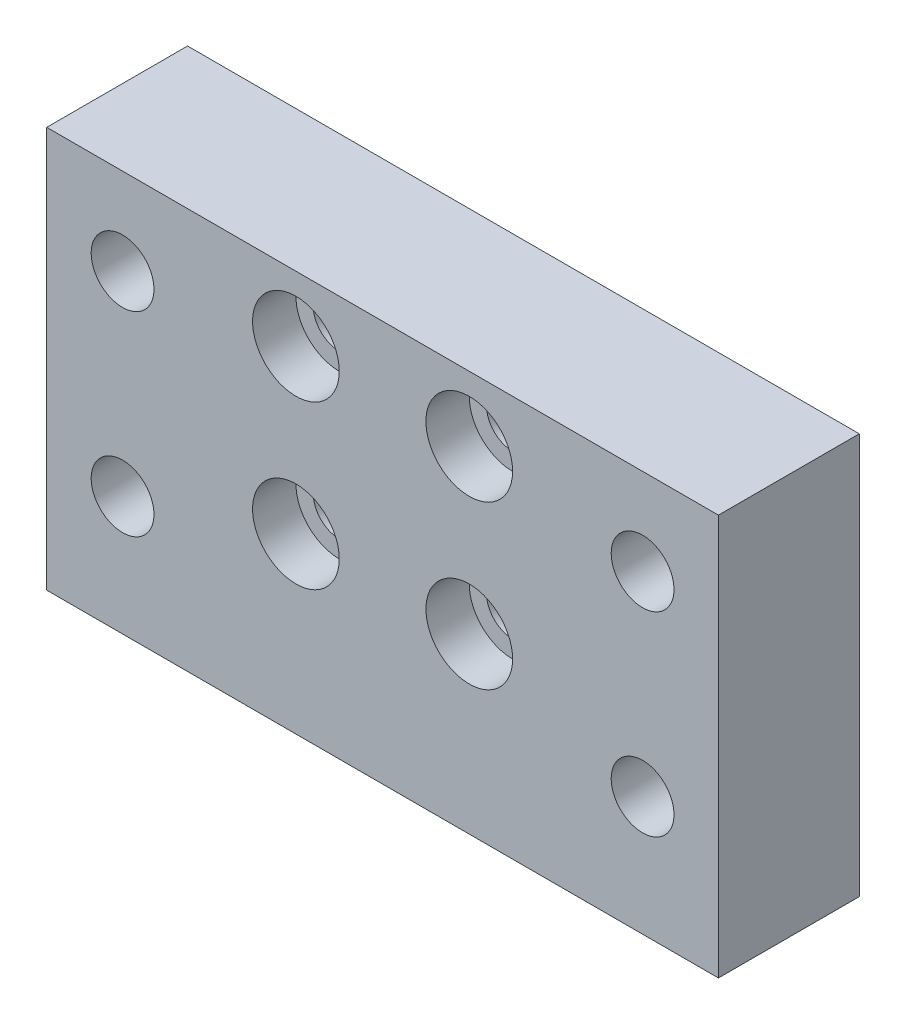
ISO-10303-21;
HEADER;
FILE_DESCRIPTION(('STEP AP214'),'2;1');
FILE_NAME('part.step','',(''),(''),'','','');
FILE_SCHEMA(('AUTOMOTIVE_DESIGN { 1 0 10303 214 1 1 1 1 }'));
ENDSEC;
DATA;
#1=APPLICATION_CONTEXT('core data for automotive mechanical design processes');
#2=APPLICATION_PROTOCOL_DEFINITION('international standard','automotive_design',2000,#1);
#3=PRODUCT_CONTEXT('',#1,'mechanical');
#4=PRODUCT('Part','Part','',(#3));
#5=PRODUCT_RELATED_PRODUCT_CATEGORY('part','',(#4));
#6=PRODUCT_DEFINITION_FORMATION('','',#4);
#7=PRODUCT_DEFINITION_CONTEXT('part definition',#1,'design');
#8=PRODUCT_DEFINITION('design','',#6,#7);
#9=PRODUCT_DEFINITION_SHAPE('','',#8);
#10=(LENGTH_UNIT() NAMED_UNIT(*) SI_UNIT(.MILLI.,.METRE.));
#11=(NAMED_UNIT(*) PLANE_ANGLE_UNIT() SI_UNIT($,.RADIAN.));
#12=(NAMED_UNIT(*) SI_UNIT($,.STERADIAN.) SOLID_ANGLE_UNIT());
#13=UNCERTAINTY_MEASURE_WITH_UNIT(LENGTH_MEASURE(1.E-05),#10,'distance_accuracy_value','');
#14=(GEOMETRIC_REPRESENTATION_CONTEXT(3) GLOBAL_UNCERTAINTY_ASSIGNED_CONTEXT((#13)) GLOBAL_UNIT_ASSIGNED_CONTEXT((#10,
#11,#12)) REPRESENTATION_CONTEXT('',''));
#15=CARTESIAN_POINT('',(0.,0.,0.));
#16=DIRECTION('',(0.,0.,1.));
#17=DIRECTION('',(1.,0.,0.));
#18=AXIS2_PLACEMENT_3D('',#15,#16,#17);
#19=CARTESIAN_POINT('',(0.,0.,13.));
#20=DIRECTION('',(1.,0.,0.));
#21=DIRECTION('',(0.,0.,-1.));
#22=AXIS2_PLACEMENT_3D('',#19,#20,#21);
#23=PLANE('',#22);
#24=DIRECTION('',(0.,-1.,0.));
#25=VECTOR('',#24,1.);
#26=CARTESIAN_POINT('',(0.,0.,0.));
#27=LINE('',#26,#25);
#28=CARTESIAN_POINT('',(0.,37.,0.));
#29=VERTEX_POINT('',#28);
#30=CARTESIAN_POINT('',(0.,0.,0.));
#31=VERTEX_POINT('',#30);
#32=EDGE_CURVE('E96',#29,#31,#27,.T.);
#33=ORIENTED_EDGE('',*,*,#32,.T.);
#34=DIRECTION('',(0.,0.,-1.));
#35=VECTOR('',#34,1.);
#36=CARTESIAN_POINT('',(0.,0.,13.));
#37=LINE('',#36,#35);
#38=CARTESIAN_POINT('',(0.,0.,13.));
#39=VERTEX_POINT('',#38);
#40=EDGE_CURVE('E11',#39,#31,#37,.T.);
#41=ORIENTED_EDGE('',*,*,#40,.F.);
#42=DIRECTION('',(0.,-1.,0.));
#43=VECTOR('',#42,1.);
#44=CARTESIAN_POINT('',(0.,0.,13.));
#45=LINE('',#44,#43);
#46=CARTESIAN_POINT('',(0.,37.,13.));
#47=VERTEX_POINT('',#46);
#48=EDGE_CURVE('E84',#47,#39,#45,.T.);
#49=ORIENTED_EDGE('',*,*,#48,.F.);
#50=DIRECTION('',(0.,0.,-1.));
#51=VECTOR('',#50,1.);
#52=CARTESIAN_POINT('',(0.,37.,13.));
#53=LINE('',#52,#51);
#54=EDGE_CURVE('E92',#47,#29,#53,.T.);
#55=ORIENTED_EDGE('',*,*,#54,.T.);
#56=EDGE_LOOP('',(#33,#41,#49,#55));
#57=FACE_BOUND('',#56,.T.);
#58=ADVANCED_FACE('F33',(#57),#23,.F.);
#59=CARTESIAN_POINT('',(0.,0.,13.));
#60=DIRECTION('',(0.,1.,0.));
#61=DIRECTION('',(0.,0.,1.));
#62=AXIS2_PLACEMENT_3D('',#59,#60,#61);
#63=PLANE('',#62);
#64=DIRECTION('',(1.,0.,0.));
#65=VECTOR('',#64,1.);
#66=CARTESIAN_POINT('',(0.,0.,0.));
#67=LINE('',#66,#65);
#68=CARTESIAN_POINT('',(62.,0.,0.));
#69=VERTEX_POINT('',#68);
#70=EDGE_CURVE('E88',#31,#69,#67,.T.);
#71=ORIENTED_EDGE('',*,*,#70,.T.);
#72=DIRECTION('',(0.,0.,-1.));
#73=VECTOR('',#72,1.);
#74=CARTESIAN_POINT('',(62.,0.,13.));
#75=LINE('',#74,#73);
#76=CARTESIAN_POINT('',(62.,0.,13.));
#77=VERTEX_POINT('',#76);
#78=EDGE_CURVE('E41',#77,#69,#75,.T.);
#79=ORIENTED_EDGE('',*,*,#78,.F.);
#80=DIRECTION('',(1.,0.,0.));
#81=VECTOR('',#80,1.);
#82=CARTESIAN_POINT('',(0.,0.,13.));
#83=LINE('',#82,#81);
#84=EDGE_CURVE('E79',#39,#77,#83,.T.);
#85=ORIENTED_EDGE('',*,*,#84,.F.);
#86=ORIENTED_EDGE('',*,*,#40,.T.);
#87=EDGE_LOOP('',(#71,#79,#85,#86));
#88=FACE_BOUND('',#87,.T.);
#89=ADVANCED_FACE('F87',(#88),#63,.F.);
#90=CARTESIAN_POINT('',(62.,0.,13.));
#91=DIRECTION('',(-1.,0.,0.));
#92=DIRECTION('',(0.,0.,1.));
#93=AXIS2_PLACEMENT_3D('',#90,#91,#92);
#94=PLANE('',#93);
#95=DIRECTION('',(0.,1.,0.));
#96=VECTOR('',#95,1.);
#97=CARTESIAN_POINT('',(62.,0.,0.));
#98=LINE('',#97,#96);
#99=CARTESIAN_POINT('',(62.,37.,0.));
#100=VERTEX_POINT('',#99);
#101=EDGE_CURVE('E66',#69,#100,#98,.T.);
#102=ORIENTED_EDGE('',*,*,#101,.T.);
#103=DIRECTION('',(0.,0.,-1.));
#104=VECTOR('',#103,1.);
#105=CARTESIAN_POINT('',(62.,37.,13.));
#106=LINE('',#105,#104);
#107=CARTESIAN_POINT('',(62.,37.,13.));
#108=VERTEX_POINT('',#107);
#109=EDGE_CURVE('E89',#108,#100,#106,.T.);
#110=ORIENTED_EDGE('',*,*,#109,.F.);
#111=DIRECTION('',(0.,1.,0.));
#112=VECTOR('',#111,1.);
#113=CARTESIAN_POINT('',(62.,0.,13.));
#114=LINE('',#113,#112);
#115=EDGE_CURVE('E82',#77,#108,#114,.T.);
#116=ORIENTED_EDGE('',*,*,#115,.F.);
#117=ORIENTED_EDGE('',*,*,#78,.T.);
#118=EDGE_LOOP('',(#102,#110,#116,#117));
#119=FACE_BOUND('',#118,.T.);
#120=ADVANCED_FACE('F90',(#119),#94,.F.);
#121=CARTESIAN_POINT('',(0.,37.,13.));
#122=DIRECTION('',(0.,-1.,0.));
#123=DIRECTION('',(0.,0.,-1.));
#124=AXIS2_PLACEMENT_3D('',#121,#122,#123);
#125=PLANE('',#124);
#126=DIRECTION('',(-1.,0.,0.));
#127=VECTOR('',#126,1.);
#128=CARTESIAN_POINT('',(0.,37.,0.));
#129=LINE('',#128,#127);
#130=EDGE_CURVE('E72',#100,#29,#129,.T.);
#131=ORIENTED_EDGE('',*,*,#130,.T.);
#132=ORIENTED_EDGE('',*,*,#54,.F.);
#133=DIRECTION('',(-1.,0.,0.));
#134=VECTOR('',#133,1.);
#135=CARTESIAN_POINT('',(0.,37.,13.));
#136=LINE('',#135,#134);
#137=EDGE_CURVE('E49',#108,#47,#136,.T.);
#138=ORIENTED_EDGE('',*,*,#137,.F.);
#139=ORIENTED_EDGE('',*,*,#109,.T.);
#140=EDGE_LOOP('',(#131,#132,#138,#139));
#141=FACE_BOUND('',#140,.T.);
#142=ADVANCED_FACE('F104',(#141),#125,.F.);
#143=CARTESIAN_POINT('',(0.,37.,13.));
#144=DIRECTION('',(0.,0.,-1.));
#145=DIRECTION('',(-1.,0.,0.));
#146=AXIS2_PLACEMENT_3D('',#143,#144,#145);
#147=PLANE('',#146);
#148=CARTESIAN_POINT('',(39.,16.,13.));
#149=DIRECTION('',(0.,0.,1.));
#150=DIRECTION('',(1.,0.,0.));
#151=AXIS2_PLACEMENT_3D('',#148,#149,#150);
#152=CIRCLE('',#151,4.);
#153=CARTESIAN_POINT('',(43.,16.,13.));
#154=VERTEX_POINT('',#153);
#155=EDGE_CURVE('E202',#154,#154,#152,.T.);
#156=ORIENTED_EDGE('',*,*,#155,.F.);
#157=EDGE_LOOP('',(#156));
#158=FACE_BOUND('',#157,.T.);
#159=CARTESIAN_POINT('',(23.,16.,13.));
#160=DIRECTION('',(0.,0.,1.));
#161=DIRECTION('',(1.,0.,0.));
#162=AXIS2_PLACEMENT_3D('',#159,#160,#161);
#163=CIRCLE('',#162,4.);
#164=CARTESIAN_POINT('',(27.,16.,13.));
#165=VERTEX_POINT('',#164);
#166=EDGE_CURVE('E190',#165,#165,#163,.T.);
#167=ORIENTED_EDGE('',*,*,#166,.F.);
#168=EDGE_LOOP('',(#167));
#169=FACE_BOUND('',#168,.T.);
#170=CARTESIAN_POINT('',(23.,31.,13.));
#171=DIRECTION('',(0.,0.,1.));
#172=DIRECTION('',(1.,0.,0.));
#173=AXIS2_PLACEMENT_3D('',#170,#171,#172);
#174=CIRCLE('',#173,4.);
#175=CARTESIAN_POINT('',(27.,31.,13.));
#176=VERTEX_POINT('',#175);
#177=EDGE_CURVE('E178',#176,#176,#174,.T.);
#178=ORIENTED_EDGE('',*,*,#177,.F.);
#179=EDGE_LOOP('',(#178));
#180=FACE_BOUND('',#179,.T.);
#181=CARTESIAN_POINT('',(39.,31.,13.));
#182=DIRECTION('',(0.,0.,1.));
#183=DIRECTION('',(1.,0.,0.));
#184=AXIS2_PLACEMENT_3D('',#181,#182,#183);
#185=CIRCLE('',#184,4.);
#186=CARTESIAN_POINT('',(43.,31.,13.));
#187=VERTEX_POINT('',#186);
#188=EDGE_CURVE('E166',#187,#187,#185,.T.);
#189=ORIENTED_EDGE('',*,*,#188,.F.);
#190=EDGE_LOOP('',(#189));
#191=FACE_BOUND('',#190,.T.);
#192=CARTESIAN_POINT('',(7.00000000000001,11.,13.));
#193=DIRECTION('',(0.,0.,-1.));
#194=DIRECTION('',(-1.,0.,0.));
#195=AXIS2_PLACEMENT_3D('',#192,#193,#194);
#196=CIRCLE('',#195,2.9);
#197=CARTESIAN_POINT('',(4.10000000000001,11.,13.));
#198=VERTEX_POINT('',#197);
#199=EDGE_CURVE('E145',#198,#198,#196,.T.);
#200=ORIENTED_EDGE('',*,*,#199,.T.);
#201=EDGE_LOOP('',(#200));
#202=FACE_BOUND('',#201,.T.);
#203=CARTESIAN_POINT('',(7.00000000000001,29.,13.));
#204=DIRECTION('',(0.,0.,-1.));
#205=DIRECTION('',(-1.,0.,0.));
#206=AXIS2_PLACEMENT_3D('',#203,#204,#205);
#207=CIRCLE('',#206,2.9);
#208=CARTESIAN_POINT('',(4.10000000000001,29.,13.));
#209=VERTEX_POINT('',#208);
#210=EDGE_CURVE('E133',#209,#209,#207,.T.);
#211=ORIENTED_EDGE('',*,*,#210,.T.);
#212=EDGE_LOOP('',(#211));
#213=FACE_BOUND('',#212,.T.);
#214=CARTESIAN_POINT('',(55.,11.,13.));
#215=DIRECTION('',(0.,0.,-1.));
#216=DIRECTION('',(-1.,0.,0.));
#217=AXIS2_PLACEMENT_3D('',#214,#215,#216);
#218=CIRCLE('',#217,2.9);
#219=CARTESIAN_POINT('',(52.1,11.,13.));
#220=VERTEX_POINT('',#219);
#221=EDGE_CURVE('E121',#220,#220,#218,.T.);
#222=ORIENTED_EDGE('',*,*,#221,.T.);
#223=EDGE_LOOP('',(#222));
#224=FACE_BOUND('',#223,.T.);
#225=CARTESIAN_POINT('',(55.,29.,13.));
#226=DIRECTION('',(0.,0.,-1.));
#227=DIRECTION('',(-1.,0.,0.));
#228=AXIS2_PLACEMENT_3D('',#225,#226,#227);
#229=CIRCLE('',#228,2.9);
#230=CARTESIAN_POINT('',(52.1,29.,13.));
#231=VERTEX_POINT('',#230);
#232=EDGE_CURVE('E99',#231,#231,#229,.T.);
#233=ORIENTED_EDGE('',*,*,#232,.T.);
#234=EDGE_LOOP('',(#233));
#235=FACE_BOUND('',#234,.T.);
#236=ORIENTED_EDGE('',*,*,#48,.T.);
#237=ORIENTED_EDGE('',*,*,#84,.T.);
#238=ORIENTED_EDGE('',*,*,#115,.T.);
#239=ORIENTED_EDGE('',*,*,#137,.T.);
#240=EDGE_LOOP('',(#236,#237,#238,#239));
#241=FACE_BOUND('',#240,.T.);
#242=ADVANCED_FACE('F80',(#158,#169,#180,#191,#202,#213,#224,#235,#241),#147,.F.);
#243=CARTESIAN_POINT('',(0.,37.,0.));
#244=DIRECTION('',(0.,0.,-1.));
#245=DIRECTION('',(-1.,0.,0.));
#246=AXIS2_PLACEMENT_3D('',#243,#244,#245);
#247=PLANE('',#246);
#248=CARTESIAN_POINT('',(39.,16.,0.));
#249=DIRECTION('',(0.,0.,1.));
#250=DIRECTION('',(1.,0.,0.));
#251=AXIS2_PLACEMENT_3D('',#248,#249,#250);
#252=CIRCLE('',#251,2.4);
#253=CARTESIAN_POINT('',(41.4,16.,0.));
#254=VERTEX_POINT('',#253);
#255=EDGE_CURVE('E193',#254,#254,#252,.T.);
#256=ORIENTED_EDGE('',*,*,#255,.T.);
#257=EDGE_LOOP('',(#256));
#258=FACE_BOUND('',#257,.T.);
#259=CARTESIAN_POINT('',(23.,16.,0.));
#260=DIRECTION('',(0.,0.,1.));
#261=DIRECTION('',(1.,0.,0.));
#262=AXIS2_PLACEMENT_3D('',#259,#260,#261);
#263=CIRCLE('',#262,2.4);
#264=CARTESIAN_POINT('',(25.4,16.,0.));
#265=VERTEX_POINT('',#264);
#266=EDGE_CURVE('E181',#265,#265,#263,.T.);
#267=ORIENTED_EDGE('',*,*,#266,.T.);
#268=EDGE_LOOP('',(#267));
#269=FACE_BOUND('',#268,.T.);
#270=CARTESIAN_POINT('',(23.,31.,0.));
#271=DIRECTION('',(0.,0.,1.));
#272=DIRECTION('',(1.,0.,0.));
#273=AXIS2_PLACEMENT_3D('',#270,#271,#272);
#274=CIRCLE('',#273,2.4);
#275=CARTESIAN_POINT('',(25.4,31.,0.));
#276=VERTEX_POINT('',#275);
#277=EDGE_CURVE('E169',#276,#276,#274,.T.);
#278=ORIENTED_EDGE('',*,*,#277,.T.);
#279=EDGE_LOOP('',(#278));
#280=FACE_BOUND('',#279,.T.);
#281=CARTESIAN_POINT('',(39.,31.,0.));
#282=DIRECTION('',(0.,0.,1.));
#283=DIRECTION('',(1.,0.,0.));
#284=AXIS2_PLACEMENT_3D('',#281,#282,#283);
#285=CIRCLE('',#284,2.4);
#286=CARTESIAN_POINT('',(41.4,31.,0.));
#287=VERTEX_POINT('',#286);
#288=EDGE_CURVE('E157',#287,#287,#285,.T.);
#289=ORIENTED_EDGE('',*,*,#288,.T.);
#290=EDGE_LOOP('',(#289));
#291=FACE_BOUND('',#290,.T.);
#292=CARTESIAN_POINT('',(7.00000000000001,11.,0.));
#293=DIRECTION('',(0.,0.,-1.));
#294=DIRECTION('',(-1.,0.,0.));
#295=AXIS2_PLACEMENT_3D('',#292,#293,#294);
#296=CIRCLE('',#295,5.);
#297=CARTESIAN_POINT('',(2.00000000000001,11.,0.));
#298=VERTEX_POINT('',#297);
#299=EDGE_CURVE('E154',#298,#298,#296,.T.);
#300=ORIENTED_EDGE('',*,*,#299,.F.);
#301=EDGE_LOOP('',(#300));
#302=FACE_BOUND('',#301,.T.);
#303=CARTESIAN_POINT('',(7.00000000000001,29.,0.));
#304=DIRECTION('',(0.,0.,-1.));
#305=DIRECTION('',(-1.,0.,0.));
#306=AXIS2_PLACEMENT_3D('',#303,#304,#305);
#307=CIRCLE('',#306,5.);
#308=CARTESIAN_POINT('',(2.00000000000001,29.,0.));
#309=VERTEX_POINT('',#308);
#310=EDGE_CURVE('E142',#309,#309,#307,.T.);
#311=ORIENTED_EDGE('',*,*,#310,.F.);
#312=EDGE_LOOP('',(#311));
#313=FACE_BOUND('',#312,.T.);
#314=CARTESIAN_POINT('',(55.,11.,0.));
#315=DIRECTION('',(0.,0.,-1.));
#316=DIRECTION('',(-1.,0.,0.));
#317=AXIS2_PLACEMENT_3D('',#314,#315,#316);
#318=CIRCLE('',#317,5.);
#319=CARTESIAN_POINT('',(50.,11.,0.));
#320=VERTEX_POINT('',#319);
#321=EDGE_CURVE('E130',#320,#320,#318,.T.);
#322=ORIENTED_EDGE('',*,*,#321,.F.);
#323=EDGE_LOOP('',(#322));
#324=FACE_BOUND('',#323,.T.);
#325=CARTESIAN_POINT('',(55.,29.,0.));
#326=DIRECTION('',(0.,0.,-1.));
#327=DIRECTION('',(-1.,0.,0.));
#328=AXIS2_PLACEMENT_3D('',#325,#326,#327);
#329=CIRCLE('',#328,5.);
#330=CARTESIAN_POINT('',(50.,29.,0.));
#331=VERTEX_POINT('',#330);
#332=EDGE_CURVE('E118',#331,#331,#329,.T.);
#333=ORIENTED_EDGE('',*,*,#332,.F.);
#334=EDGE_LOOP('',(#333));
#335=FACE_BOUND('',#334,.T.);
#336=ORIENTED_EDGE('',*,*,#32,.F.);
#337=ORIENTED_EDGE('',*,*,#130,.F.);
#338=ORIENTED_EDGE('',*,*,#101,.F.);
#339=ORIENTED_EDGE('',*,*,#70,.F.);
#340=EDGE_LOOP('',(#336,#337,#338,#339));
#341=FACE_BOUND('',#340,.T.);
#342=ADVANCED_FACE('F107',(#258,#269,#280,#291,#302,#313,#324,#335,#341),#247,.T.);
#343=CARTESIAN_POINT('',(55.,29.,0.));
#344=DIRECTION('',(0.,0.,-1.));
#345=DIRECTION('',(-1.,0.,0.));
#346=AXIS2_PLACEMENT_3D('',#343,#344,#345);
#347=CYLINDRICAL_SURFACE('',#346,2.9);
#348=ORIENTED_EDGE('',*,*,#232,.F.);
#349=EDGE_LOOP('',(#348));
#350=FACE_BOUND('',#349,.T.);
#351=CARTESIAN_POINT('',(55.,29.,5.));
#352=DIRECTION('',(0.,0.,-1.));
#353=DIRECTION('',(-1.,0.,0.));
#354=AXIS2_PLACEMENT_3D('',#351,#352,#353);
#355=CIRCLE('',#354,2.9);
#356=CARTESIAN_POINT('',(52.1,29.,5.));
#357=VERTEX_POINT('',#356);
#358=EDGE_CURVE('E112',#357,#357,#355,.T.);
#359=ORIENTED_EDGE('',*,*,#358,.T.);
#360=EDGE_LOOP('',(#359));
#361=FACE_BOUND('',#360,.T.);
#362=ADVANCED_FACE('F225',(#350,#361),#347,.F.);
#363=CARTESIAN_POINT('',(57.9,29.,5.));
#364=DIRECTION('',(0.,0.,1.));
#365=DIRECTION('',(1.,0.,0.));
#366=AXIS2_PLACEMENT_3D('',#363,#364,#365);
#367=PLANE('',#366);
#368=ORIENTED_EDGE('',*,*,#358,.F.);
#369=EDGE_LOOP('',(#368));
#370=FACE_BOUND('',#369,.T.);
#371=CARTESIAN_POINT('',(55.,29.,5.));
#372=DIRECTION('',(0.,0.,-1.));
#373=DIRECTION('',(-1.,0.,0.));
#374=AXIS2_PLACEMENT_3D('',#371,#372,#373);
#375=CIRCLE('',#374,5.);
#376=CARTESIAN_POINT('',(50.,29.,5.));
#377=VERTEX_POINT('',#376);
#378=EDGE_CURVE('E115',#377,#377,#375,.T.);
#379=ORIENTED_EDGE('',*,*,#378,.T.);
#380=EDGE_LOOP('',(#379));
#381=FACE_BOUND('',#380,.T.);
#382=ADVANCED_FACE('F228',(#370,#381),#367,.F.);
#383=CARTESIAN_POINT('',(55.,29.,0.));
#384=DIRECTION('',(0.,0.,-1.));
#385=DIRECTION('',(-1.,0.,0.));
#386=AXIS2_PLACEMENT_3D('',#383,#384,#385);
#387=CYLINDRICAL_SURFACE('',#386,5.);
#388=ORIENTED_EDGE('',*,*,#378,.F.);
#389=EDGE_LOOP('',(#388));
#390=FACE_BOUND('',#389,.T.);
#391=ORIENTED_EDGE('',*,*,#332,.T.);
#392=EDGE_LOOP('',(#391));
#393=FACE_BOUND('',#392,.T.);
#394=ADVANCED_FACE('F234',(#390,#393),#387,.F.);
#395=CARTESIAN_POINT('',(55.,11.,0.));
#396=DIRECTION('',(0.,0.,-1.));
#397=DIRECTION('',(-1.,0.,0.));
#398=AXIS2_PLACEMENT_3D('',#395,#396,#397);
#399=CYLINDRICAL_SURFACE('',#398,2.9);
#400=ORIENTED_EDGE('',*,*,#221,.F.);
#401=EDGE_LOOP('',(#400));
#402=FACE_BOUND('',#401,.T.);
#403=CARTESIAN_POINT('',(55.,11.,5.));
#404=DIRECTION('',(0.,0.,-1.));
#405=DIRECTION('',(-1.,0.,0.));
#406=AXIS2_PLACEMENT_3D('',#403,#404,#405);
#407=CIRCLE('',#406,2.9);
#408=CARTESIAN_POINT('',(52.1,11.,5.));
#409=VERTEX_POINT('',#408);
#410=EDGE_CURVE('E124',#409,#409,#407,.T.);
#411=ORIENTED_EDGE('',*,*,#410,.T.);
#412=EDGE_LOOP('',(#411));
#413=FACE_BOUND('',#412,.T.);
#414=ADVANCED_FACE('F240',(#402,#413),#399,.F.);
#415=CARTESIAN_POINT('',(57.9,11.,5.));
#416=DIRECTION('',(0.,0.,1.));
#417=DIRECTION('',(1.,0.,0.));
#418=AXIS2_PLACEMENT_3D('',#415,#416,#417);
#419=PLANE('',#418);
#420=ORIENTED_EDGE('',*,*,#410,.F.);
#421=EDGE_LOOP('',(#420));
#422=FACE_BOUND('',#421,.T.);
#423=CARTESIAN_POINT('',(55.,11.,5.));
#424=DIRECTION('',(0.,0.,-1.));
#425=DIRECTION('',(-1.,0.,0.));
#426=AXIS2_PLACEMENT_3D('',#423,#424,#425);
#427=CIRCLE('',#426,5.);
#428=CARTESIAN_POINT('',(50.,11.,5.));
#429=VERTEX_POINT('',#428);
#430=EDGE_CURVE('E127',#429,#429,#427,.T.);
#431=ORIENTED_EDGE('',*,*,#430,.T.);
#432=EDGE_LOOP('',(#431));
#433=FACE_BOUND('',#432,.T.);
#434=ADVANCED_FACE('F430',(#422,#433),#419,.F.);
#435=CARTESIAN_POINT('',(55.,11.,0.));
#436=DIRECTION('',(0.,0.,-1.));
#437=DIRECTION('',(-1.,0.,0.));
#438=AXIS2_PLACEMENT_3D('',#435,#436,#437);
#439=CYLINDRICAL_SURFACE('',#438,5.);
#440=ORIENTED_EDGE('',*,*,#430,.F.);
#441=EDGE_LOOP('',(#440));
#442=FACE_BOUND('',#441,.T.);
#443=ORIENTED_EDGE('',*,*,#321,.T.);
#444=EDGE_LOOP('',(#443));
#445=FACE_BOUND('',#444,.T.);
#446=ADVANCED_FACE('F426',(#442,#445),#439,.F.);
#447=CARTESIAN_POINT('',(7.00000000000001,29.,0.));
#448=DIRECTION('',(0.,0.,-1.));
#449=DIRECTION('',(-1.,0.,0.));
#450=AXIS2_PLACEMENT_3D('',#447,#448,#449);
#451=CYLINDRICAL_SURFACE('',#450,2.9);
#452=ORIENTED_EDGE('',*,*,#210,.F.);
#453=EDGE_LOOP('',(#452));
#454=FACE_BOUND('',#453,.T.);
#455=CARTESIAN_POINT('',(7.00000000000001,29.,5.));
#456=DIRECTION('',(0.,0.,-1.));
#457=DIRECTION('',(-1.,0.,0.));
#458=AXIS2_PLACEMENT_3D('',#455,#456,#457);
#459=CIRCLE('',#458,2.9);
#460=CARTESIAN_POINT('',(4.10000000000001,29.,5.));
#461=VERTEX_POINT('',#460);
#462=EDGE_CURVE('E136',#461,#461,#459,.T.);
#463=ORIENTED_EDGE('',*,*,#462,.T.);
#464=EDGE_LOOP('',(#463));
#465=FACE_BOUND('',#464,.T.);
#466=ADVANCED_FACE('F422',(#454,#465),#451,.F.);
#467=CARTESIAN_POINT('',(9.90000000000001,29.,5.));
#468=DIRECTION('',(0.,0.,1.));
#469=DIRECTION('',(1.,0.,0.));
#470=AXIS2_PLACEMENT_3D('',#467,#468,#469);
#471=PLANE('',#470);
#472=ORIENTED_EDGE('',*,*,#462,.F.);
#473=EDGE_LOOP('',(#472));
#474=FACE_BOUND('',#473,.T.);
#475=CARTESIAN_POINT('',(7.00000000000001,29.,5.));
#476=DIRECTION('',(0.,0.,-1.));
#477=DIRECTION('',(-1.,0.,0.));
#478=AXIS2_PLACEMENT_3D('',#475,#476,#477);
#479=CIRCLE('',#478,5.);
#480=CARTESIAN_POINT('',(2.00000000000001,29.,5.));
#481=VERTEX_POINT('',#480);
#482=EDGE_CURVE('E139',#481,#481,#479,.T.);
#483=ORIENTED_EDGE('',*,*,#482,.T.);
#484=EDGE_LOOP('',(#483));
#485=FACE_BOUND('',#484,.T.);
#486=ADVANCED_FACE('F418',(#474,#485),#471,.F.);
#487=CARTESIAN_POINT('',(7.00000000000001,29.,0.));
#488=DIRECTION('',(0.,0.,-1.));
#489=DIRECTION('',(-1.,0.,0.));
#490=AXIS2_PLACEMENT_3D('',#487,#488,#489);
#491=CYLINDRICAL_SURFACE('',#490,5.);
#492=ORIENTED_EDGE('',*,*,#482,.F.);
#493=EDGE_LOOP('',(#492));
#494=FACE_BOUND('',#493,.T.);
#495=ORIENTED_EDGE('',*,*,#310,.T.);
#496=EDGE_LOOP('',(#495));
#497=FACE_BOUND('',#496,.T.);
#498=ADVANCED_FACE('F414',(#494,#497),#491,.F.);
#499=CARTESIAN_POINT('',(7.00000000000001,11.,0.));
#500=DIRECTION('',(0.,0.,-1.));
#501=DIRECTION('',(-1.,0.,0.));
#502=AXIS2_PLACEMENT_3D('',#499,#500,#501);
#503=CYLINDRICAL_SURFACE('',#502,2.9);
#504=ORIENTED_EDGE('',*,*,#199,.F.);
#505=EDGE_LOOP('',(#504));
#506=FACE_BOUND('',#505,.T.);
#507=CARTESIAN_POINT('',(7.00000000000001,11.,5.));
#508=DIRECTION('',(0.,0.,-1.));
#509=DIRECTION('',(-1.,0.,0.));
#510=AXIS2_PLACEMENT_3D('',#507,#508,#509);
#511=CIRCLE('',#510,2.9);
#512=CARTESIAN_POINT('',(4.10000000000001,11.,5.));
#513=VERTEX_POINT('',#512);
#514=EDGE_CURVE('E148',#513,#513,#511,.T.);
#515=ORIENTED_EDGE('',*,*,#514,.T.);
#516=EDGE_LOOP('',(#515));
#517=FACE_BOUND('',#516,.T.);
#518=ADVANCED_FACE('F410',(#506,#517),#503,.F.);
#519=CARTESIAN_POINT('',(9.90000000000001,11.,5.));
#520=DIRECTION('',(0.,0.,1.));
#521=DIRECTION('',(1.,0.,0.));
#522=AXIS2_PLACEMENT_3D('',#519,#520,#521);
#523=PLANE('',#522);
#524=ORIENTED_EDGE('',*,*,#514,.F.);
#525=EDGE_LOOP('',(#524));
#526=FACE_BOUND('',#525,.T.);
#527=CARTESIAN_POINT('',(7.00000000000001,11.,5.));
#528=DIRECTION('',(0.,0.,-1.));
#529=DIRECTION('',(-1.,0.,0.));
#530=AXIS2_PLACEMENT_3D('',#527,#528,#529);
#531=CIRCLE('',#530,5.);
#532=CARTESIAN_POINT('',(2.00000000000001,11.,5.));
#533=VERTEX_POINT('',#532);
#534=EDGE_CURVE('E151',#533,#533,#531,.T.);
#535=ORIENTED_EDGE('',*,*,#534,.T.);
#536=EDGE_LOOP('',(#535));
#537=FACE_BOUND('',#536,.T.);
#538=ADVANCED_FACE('F406',(#526,#537),#523,.F.);
#539=CARTESIAN_POINT('',(7.00000000000001,11.,0.));
#540=DIRECTION('',(0.,0.,-1.));
#541=DIRECTION('',(-1.,0.,0.));
#542=AXIS2_PLACEMENT_3D('',#539,#540,#541);
#543=CYLINDRICAL_SURFACE('',#542,5.);
#544=ORIENTED_EDGE('',*,*,#534,.F.);
#545=EDGE_LOOP('',(#544));
#546=FACE_BOUND('',#545,.T.);
#547=ORIENTED_EDGE('',*,*,#299,.T.);
#548=EDGE_LOOP('',(#547));
#549=FACE_BOUND('',#548,.T.);
#550=ADVANCED_FACE('F275',(#546,#549),#543,.F.);
#551=CARTESIAN_POINT('',(39.,31.,13.));
#552=DIRECTION('',(0.,0.,1.));
#553=DIRECTION('',(1.,0.,0.));
#554=AXIS2_PLACEMENT_3D('',#551,#552,#553);
#555=CYLINDRICAL_SURFACE('',#554,2.4);
#556=ORIENTED_EDGE('',*,*,#288,.F.);
#557=EDGE_LOOP('',(#556));
#558=FACE_BOUND('',#557,.T.);
#559=CARTESIAN_POINT('',(39.,31.,9.));
#560=DIRECTION('',(0.,0.,1.));
#561=DIRECTION('',(1.,0.,0.));
#562=AXIS2_PLACEMENT_3D('',#559,#560,#561);
#563=CIRCLE('',#562,2.40000000000001);
#564=CARTESIAN_POINT('',(41.4,31.,9.));
#565=VERTEX_POINT('',#564);
#566=EDGE_CURVE('E160',#565,#565,#563,.T.);
#567=ORIENTED_EDGE('',*,*,#566,.T.);
#568=EDGE_LOOP('',(#567));
#569=FACE_BOUND('',#568,.T.);
#570=ADVANCED_FACE('F285',(#558,#569),#555,.F.);
#571=CARTESIAN_POINT('',(41.4,31.,9.));
#572=DIRECTION('',(0.,0.,-1.));
#573=DIRECTION('',(-1.,0.,0.));
#574=AXIS2_PLACEMENT_3D('',#571,#572,#573);
#575=PLANE('',#574);
#576=ORIENTED_EDGE('',*,*,#566,.F.);
#577=EDGE_LOOP('',(#576));
#578=FACE_BOUND('',#577,.T.);
#579=CARTESIAN_POINT('',(39.,31.,9.));
#580=DIRECTION('',(0.,0.,1.));
#581=DIRECTION('',(1.,0.,0.));
#582=AXIS2_PLACEMENT_3D('',#579,#580,#581);
#583=CIRCLE('',#582,4.);
#584=CARTESIAN_POINT('',(43.,31.,9.));
#585=VERTEX_POINT('',#584);
#586=EDGE_CURVE('E163',#585,#585,#583,.T.);
#587=ORIENTED_EDGE('',*,*,#586,.T.);
#588=EDGE_LOOP('',(#587));
#589=FACE_BOUND('',#588,.T.);
#590=ADVANCED_FACE('F290',(#578,#589),#575,.F.);
#591=CARTESIAN_POINT('',(39.,31.,13.));
#592=DIRECTION('',(0.,0.,1.));
#593=DIRECTION('',(1.,0.,0.));
#594=AXIS2_PLACEMENT_3D('',#591,#592,#593);
#595=CYLINDRICAL_SURFACE('',#594,4.);
#596=ORIENTED_EDGE('',*,*,#586,.F.);
#597=EDGE_LOOP('',(#596));
#598=FACE_BOUND('',#597,.T.);
#599=ORIENTED_EDGE('',*,*,#188,.T.);
#600=EDGE_LOOP('',(#599));
#601=FACE_BOUND('',#600,.T.);
#602=ADVANCED_FACE('F300',(#598,#601),#595,.F.);
#603=CARTESIAN_POINT('',(23.,31.,13.));
#604=DIRECTION('',(0.,0.,1.));
#605=DIRECTION('',(1.,0.,0.));
#606=AXIS2_PLACEMENT_3D('',#603,#604,#605);
#607=CYLINDRICAL_SURFACE('',#606,2.4);
#608=ORIENTED_EDGE('',*,*,#277,.F.);
#609=EDGE_LOOP('',(#608));
#610=FACE_BOUND('',#609,.T.);
#611=CARTESIAN_POINT('',(23.,31.,9.));
#612=DIRECTION('',(0.,0.,1.));
#613=DIRECTION('',(1.,0.,0.));
#614=AXIS2_PLACEMENT_3D('',#611,#612,#613);
#615=CIRCLE('',#614,2.40000000000001);
#616=CARTESIAN_POINT('',(25.4,31.,9.));
#617=VERTEX_POINT('',#616);
#618=EDGE_CURVE('E172',#617,#617,#615,.T.);
#619=ORIENTED_EDGE('',*,*,#618,.T.);
#620=EDGE_LOOP('',(#619));
#621=FACE_BOUND('',#620,.T.);
#622=ADVANCED_FACE('F310',(#610,#621),#607,.F.);
#623=CARTESIAN_POINT('',(25.4,31.,9.));
#624=DIRECTION('',(0.,0.,-1.));
#625=DIRECTION('',(-1.,0.,0.));
#626=AXIS2_PLACEMENT_3D('',#623,#624,#625);
#627=PLANE('',#626);
#628=ORIENTED_EDGE('',*,*,#618,.F.);
#629=EDGE_LOOP('',(#628));
#630=FACE_BOUND('',#629,.T.);
#631=CARTESIAN_POINT('',(23.,31.,9.));
#632=DIRECTION('',(0.,0.,1.));
#633=DIRECTION('',(1.,0.,0.));
#634=AXIS2_PLACEMENT_3D('',#631,#632,#633);
#635=CIRCLE('',#634,4.);
#636=CARTESIAN_POINT('',(27.,31.,9.));
#637=VERTEX_POINT('',#636);
#638=EDGE_CURVE('E175',#637,#637,#635,.T.);
#639=ORIENTED_EDGE('',*,*,#638,.T.);
#640=EDGE_LOOP('',(#639));
#641=FACE_BOUND('',#640,.T.);
#642=ADVANCED_FACE('F320',(#630,#641),#627,.F.);
#643=CARTESIAN_POINT('',(23.,31.,13.));
#644=DIRECTION('',(0.,0.,1.));
#645=DIRECTION('',(1.,0.,0.));
#646=AXIS2_PLACEMENT_3D('',#643,#644,#645);
#647=CYLINDRICAL_SURFACE('',#646,4.);
#648=ORIENTED_EDGE('',*,*,#638,.F.);
#649=EDGE_LOOP('',(#648));
#650=FACE_BOUND('',#649,.T.);
#651=ORIENTED_EDGE('',*,*,#177,.T.);
#652=EDGE_LOOP('',(#651));
#653=FACE_BOUND('',#652,.T.);
#654=ADVANCED_FACE('F330',(#650,#653),#647,.F.);
#655=CARTESIAN_POINT('',(23.,16.,13.));
#656=DIRECTION('',(0.,0.,1.));
#657=DIRECTION('',(1.,0.,0.));
#658=AXIS2_PLACEMENT_3D('',#655,#656,#657);
#659=CYLINDRICAL_SURFACE('',#658,2.4);
#660=ORIENTED_EDGE('',*,*,#266,.F.);
#661=EDGE_LOOP('',(#660));
#662=FACE_BOUND('',#661,.T.);
#663=CARTESIAN_POINT('',(23.,16.,9.));
#664=DIRECTION('',(0.,0.,1.));
#665=DIRECTION('',(1.,0.,0.));
#666=AXIS2_PLACEMENT_3D('',#663,#664,#665);
#667=CIRCLE('',#666,2.40000000000001);
#668=CARTESIAN_POINT('',(25.4,16.,9.));
#669=VERTEX_POINT('',#668);
#670=EDGE_CURVE('E184',#669,#669,#667,.T.);
#671=ORIENTED_EDGE('',*,*,#670,.T.);
#672=EDGE_LOOP('',(#671));
#673=FACE_BOUND('',#672,.T.);
#674=ADVANCED_FACE('F340',(#662,#673),#659,.F.);
#675=CARTESIAN_POINT('',(25.4,16.,9.));
#676=DIRECTION('',(0.,0.,-1.));
#677=DIRECTION('',(-1.,0.,0.));
#678=AXIS2_PLACEMENT_3D('',#675,#676,#677);
#679=PLANE('',#678);
#680=ORIENTED_EDGE('',*,*,#670,.F.);
#681=EDGE_LOOP('',(#680));
#682=FACE_BOUND('',#681,.T.);
#683=CARTESIAN_POINT('',(23.,16.,9.));
#684=DIRECTION('',(0.,0.,1.));
#685=DIRECTION('',(1.,0.,0.));
#686=AXIS2_PLACEMENT_3D('',#683,#684,#685);
#687=CIRCLE('',#686,4.);
#688=CARTESIAN_POINT('',(27.,16.,9.));
#689=VERTEX_POINT('',#688);
#690=EDGE_CURVE('E187',#689,#689,#687,.T.);
#691=ORIENTED_EDGE('',*,*,#690,.T.);
#692=EDGE_LOOP('',(#691));
#693=FACE_BOUND('',#692,.T.);
#694=ADVANCED_FACE('F350',(#682,#693),#679,.F.);
#695=CARTESIAN_POINT('',(23.,16.,13.));
#696=DIRECTION('',(0.,0.,1.));
#697=DIRECTION('',(1.,0.,0.));
#698=AXIS2_PLACEMENT_3D('',#695,#696,#697);
#699=CYLINDRICAL_SURFACE('',#698,4.);
#700=ORIENTED_EDGE('',*,*,#690,.F.);
#701=EDGE_LOOP('',(#700));
#702=FACE_BOUND('',#701,.T.);
#703=ORIENTED_EDGE('',*,*,#166,.T.);
#704=EDGE_LOOP('',(#703));
#705=FACE_BOUND('',#704,.T.);
#706=ADVANCED_FACE('F360',(#702,#705),#699,.F.);
#707=CARTESIAN_POINT('',(39.,16.,13.));
#708=DIRECTION('',(0.,0.,1.));
#709=DIRECTION('',(1.,0.,0.));
#710=AXIS2_PLACEMENT_3D('',#707,#708,#709);
#711=CYLINDRICAL_SURFACE('',#710,2.4);
#712=ORIENTED_EDGE('',*,*,#255,.F.);
#713=EDGE_LOOP('',(#712));
#714=FACE_BOUND('',#713,.T.);
#715=CARTESIAN_POINT('',(39.,16.,9.));
#716=DIRECTION('',(0.,0.,1.));
#717=DIRECTION('',(1.,0.,0.));
#718=AXIS2_PLACEMENT_3D('',#715,#716,#717);
#719=CIRCLE('',#718,2.40000000000001);
#720=CARTESIAN_POINT('',(41.4,16.,9.));
#721=VERTEX_POINT('',#720);
#722=EDGE_CURVE('E196',#721,#721,#719,.T.);
#723=ORIENTED_EDGE('',*,*,#722,.T.);
#724=EDGE_LOOP('',(#723));
#725=FACE_BOUND('',#724,.T.);
#726=ADVANCED_FACE('F370',(#714,#725),#711,.F.);
#727=CARTESIAN_POINT('',(41.4,16.,9.));
#728=DIRECTION('',(0.,0.,-1.));
#729=DIRECTION('',(-1.,0.,0.));
#730=AXIS2_PLACEMENT_3D('',#727,#728,#729);
#731=PLANE('',#730);
#732=ORIENTED_EDGE('',*,*,#722,.F.);
#733=EDGE_LOOP('',(#732));
#734=FACE_BOUND('',#733,.T.);
#735=CARTESIAN_POINT('',(39.,16.,9.));
#736=DIRECTION('',(0.,0.,1.));
#737=DIRECTION('',(1.,0.,0.));
#738=AXIS2_PLACEMENT_3D('',#735,#736,#737);
#739=CIRCLE('',#738,4.);
#740=CARTESIAN_POINT('',(43.,16.,9.));
#741=VERTEX_POINT('',#740);
#742=EDGE_CURVE('E199',#741,#741,#739,.T.);
#743=ORIENTED_EDGE('',*,*,#742,.T.);
#744=EDGE_LOOP('',(#743));
#745=FACE_BOUND('',#744,.T.);
#746=ADVANCED_FACE('F380',(#734,#745),#731,.F.);
#747=CARTESIAN_POINT('',(39.,16.,13.));
#748=DIRECTION('',(0.,0.,1.));
#749=DIRECTION('',(1.,0.,0.));
#750=AXIS2_PLACEMENT_3D('',#747,#748,#749);
#751=CYLINDRICAL_SURFACE('',#750,4.);
#752=ORIENTED_EDGE('',*,*,#742,.F.);
#753=EDGE_LOOP('',(#752));
#754=FACE_BOUND('',#753,.T.);
#755=ORIENTED_EDGE('',*,*,#155,.T.);
#756=EDGE_LOOP('',(#755));
#757=FACE_BOUND('',#756,.T.);
#758=ADVANCED_FACE('F206',(#754,#757),#751,.F.);
#759=CLOSED_SHELL('',(#58,#89,#120,#142,#242,#342,#362,#382,#394,#414,#434,#446,#466,#486,#498,
#518,#538,#550,#570,#590,#602,#622,#642,#654,#674,#694,#706,#726,#746,#758));
#760=MANIFOLD_SOLID_BREP('B2',#759);
#761=ADVANCED_BREP_SHAPE_REPRESENTATION('',(#18,#760),#14);
#762=SHAPE_DEFINITION_REPRESENTATION(#9,#761);
ENDSEC;
END-ISO-10303-21;
